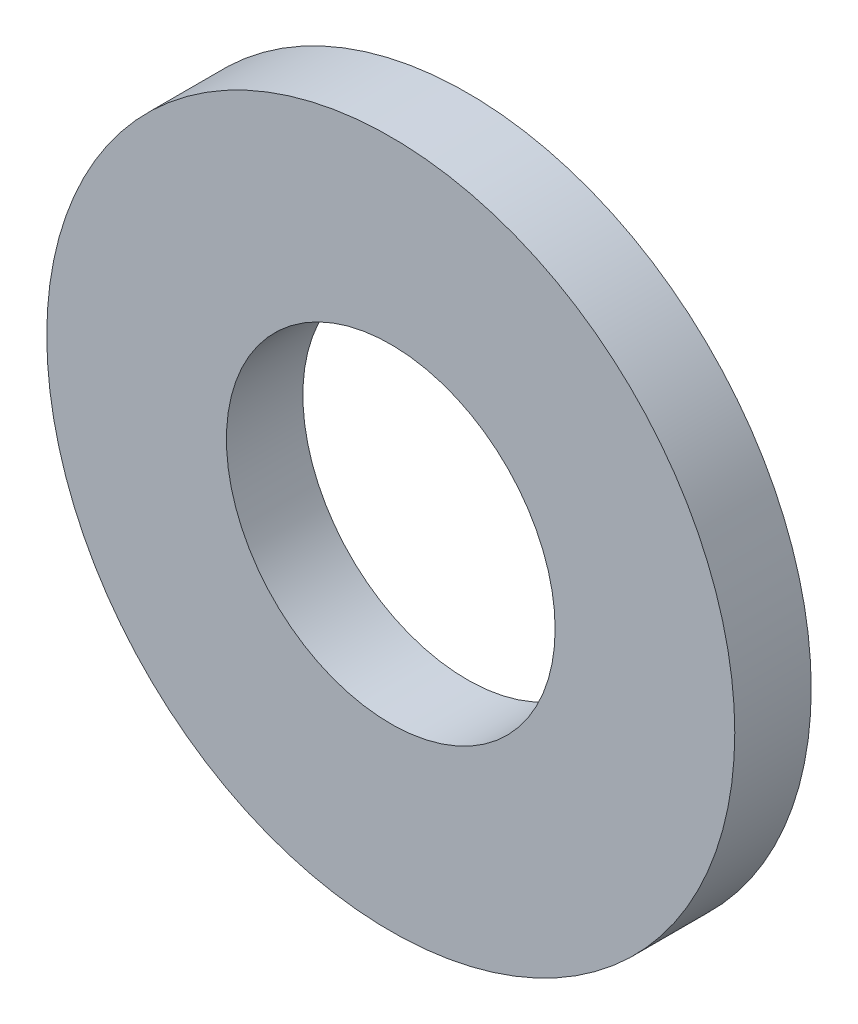
ISO-10303-21;
HEADER;
FILE_DESCRIPTION(('STEP AP214'),'2;1');
FILE_NAME('part.step','',(''),(''),'','','');
FILE_SCHEMA(('AUTOMOTIVE_DESIGN { 1 0 10303 214 1 1 1 1 }'));
ENDSEC;
DATA;
#1=APPLICATION_CONTEXT('core data for automotive mechanical design processes');
#2=APPLICATION_PROTOCOL_DEFINITION('international standard','automotive_design',2000,#1);
#3=PRODUCT_CONTEXT('',#1,'mechanical');
#4=PRODUCT('Part','Part','',(#3));
#5=PRODUCT_RELATED_PRODUCT_CATEGORY('part','',(#4));
#6=PRODUCT_DEFINITION_FORMATION('','',#4);
#7=PRODUCT_DEFINITION_CONTEXT('part definition',#1,'design');
#8=PRODUCT_DEFINITION('design','',#6,#7);
#9=PRODUCT_DEFINITION_SHAPE('','',#8);
#10=(LENGTH_UNIT() NAMED_UNIT(*) SI_UNIT(.MILLI.,.METRE.));
#11=(NAMED_UNIT(*) PLANE_ANGLE_UNIT() SI_UNIT($,.RADIAN.));
#12=(NAMED_UNIT(*) SI_UNIT($,.STERADIAN.) SOLID_ANGLE_UNIT());
#13=UNCERTAINTY_MEASURE_WITH_UNIT(LENGTH_MEASURE(1.E-05),#10,'distance_accuracy_value','');
#14=(GEOMETRIC_REPRESENTATION_CONTEXT(3) GLOBAL_UNCERTAINTY_ASSIGNED_CONTEXT((#13)) GLOBAL_UNIT_ASSIGNED_CONTEXT((#10,
#11,#12)) REPRESENTATION_CONTEXT('',''));
#15=CARTESIAN_POINT('',(0.,0.,0.));
#16=DIRECTION('',(0.,0.,1.));
#17=DIRECTION('',(1.,0.,0.));
#18=AXIS2_PLACEMENT_3D('',#15,#16,#17);
#19=CARTESIAN_POINT('',(0.,0.,1.));
#20=DIRECTION('',(0.,0.,1.));
#21=DIRECTION('',(1.,0.,0.));
#22=AXIS2_PLACEMENT_3D('',#19,#20,#21);
#23=PLANE('',#22);
#24=CARTESIAN_POINT('',(0.,0.,1.));
#25=DIRECTION('',(0.,0.,1.));
#26=DIRECTION('',(1.,0.,0.));
#27=AXIS2_PLACEMENT_3D('',#24,#25,#26);
#28=CIRCLE('',#27,4.5);
#29=CARTESIAN_POINT('',(4.5,0.,1.));
#30=VERTEX_POINT('',#29);
#31=EDGE_CURVE('E10',#30,#30,#28,.T.);
#32=ORIENTED_EDGE('',*,*,#31,.T.);
#33=EDGE_LOOP('',(#32));
#34=FACE_BOUND('',#33,.T.);
#35=CARTESIAN_POINT('',(0.,0.,1.));
#36=DIRECTION('',(0.,0.,1.));
#37=DIRECTION('',(1.,0.,0.));
#38=AXIS2_PLACEMENT_3D('',#35,#36,#37);
#39=CIRCLE('',#38,2.15);
#40=CARTESIAN_POINT('',(2.15,0.,1.));
#41=VERTEX_POINT('',#40);
#42=EDGE_CURVE('E54',#41,#41,#39,.T.);
#43=ORIENTED_EDGE('',*,*,#42,.F.);
#44=EDGE_LOOP('',(#43));
#45=FACE_BOUND('',#44,.T.);
#46=ADVANCED_FACE('F41',(#34,#45),#23,.T.);
#47=CARTESIAN_POINT('',(0.,0.,0.));
#48=DIRECTION('',(0.,0.,1.));
#49=DIRECTION('',(1.,0.,0.));
#50=AXIS2_PLACEMENT_3D('',#47,#48,#49);
#51=PLANE('',#50);
#52=CARTESIAN_POINT('',(0.,0.,0.));
#53=DIRECTION('',(0.,0.,1.));
#54=DIRECTION('',(1.,0.,0.));
#55=AXIS2_PLACEMENT_3D('',#52,#53,#54);
#56=CIRCLE('',#55,4.5);
#57=CARTESIAN_POINT('',(4.5,0.,0.));
#58=VERTEX_POINT('',#57);
#59=EDGE_CURVE('E45',#58,#58,#56,.T.);
#60=ORIENTED_EDGE('',*,*,#59,.F.);
#61=EDGE_LOOP('',(#60));
#62=FACE_BOUND('',#61,.T.);
#63=CARTESIAN_POINT('',(0.,0.,0.));
#64=DIRECTION('',(0.,0.,1.));
#65=DIRECTION('',(1.,0.,0.));
#66=AXIS2_PLACEMENT_3D('',#63,#64,#65);
#67=CIRCLE('',#66,2.15);
#68=CARTESIAN_POINT('',(2.15,0.,0.));
#69=VERTEX_POINT('',#68);
#70=EDGE_CURVE('E56',#69,#69,#67,.T.);
#71=ORIENTED_EDGE('',*,*,#70,.T.);
#72=EDGE_LOOP('',(#71));
#73=FACE_BOUND('',#72,.T.);
#74=ADVANCED_FACE('F68',(#62,#73),#51,.F.);
#75=CARTESIAN_POINT('',(0.,0.,1.));
#76=DIRECTION('',(0.,0.,-1.));
#77=DIRECTION('',(-1.,0.,0.));
#78=AXIS2_PLACEMENT_3D('',#75,#76,#77);
#79=CYLINDRICAL_SURFACE('',#78,4.5);
#80=ORIENTED_EDGE('',*,*,#31,.F.);
#81=EDGE_LOOP('',(#80));
#82=FACE_BOUND('',#81,.T.);
#83=ORIENTED_EDGE('',*,*,#59,.T.);
#84=EDGE_LOOP('',(#83));
#85=FACE_BOUND('',#84,.T.);
#86=ADVANCED_FACE('F43',(#82,#85),#79,.T.);
#87=CARTESIAN_POINT('',(0.,0.,1.));
#88=DIRECTION('',(0.,0.,-1.));
#89=DIRECTION('',(-1.,0.,0.));
#90=AXIS2_PLACEMENT_3D('',#87,#88,#89);
#91=CYLINDRICAL_SURFACE('',#90,2.15);
#92=ORIENTED_EDGE('',*,*,#42,.T.);
#93=EDGE_LOOP('',(#92));
#94=FACE_BOUND('',#93,.T.);
#95=ORIENTED_EDGE('',*,*,#70,.F.);
#96=EDGE_LOOP('',(#95));
#97=FACE_BOUND('',#96,.T.);
#98=ADVANCED_FACE('F64',(#94,#97),#91,.F.);
#99=CLOSED_SHELL('',(#46,#74,#86,#98));
#100=MANIFOLD_SOLID_BREP('B2',#99);
#101=ADVANCED_BREP_SHAPE_REPRESENTATION('',(#18,#100),#14);
#102=SHAPE_DEFINITION_REPRESENTATION(#9,#101);
ENDSEC;
END-ISO-10303-21;
